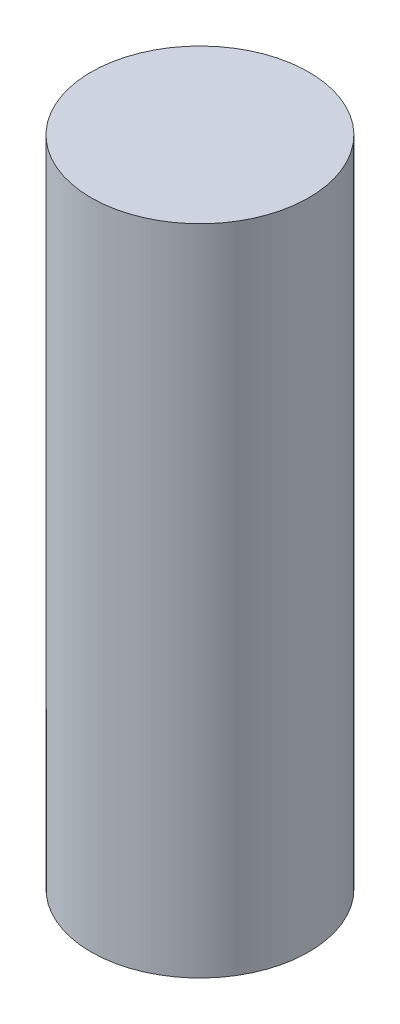
ISO-10303-21;
HEADER;
FILE_DESCRIPTION(('STEP AP214'),'2;1');
FILE_NAME('part.step','',(''),(''),'','','');
FILE_SCHEMA(('AUTOMOTIVE_DESIGN { 1 0 10303 214 1 1 1 1 }'));
ENDSEC;
DATA;
#1=APPLICATION_CONTEXT('core data for automotive mechanical design processes');
#2=APPLICATION_PROTOCOL_DEFINITION('international standard','automotive_design',2000,#1);
#3=PRODUCT_CONTEXT('',#1,'mechanical');
#4=PRODUCT('Part','Part','',(#3));
#5=PRODUCT_RELATED_PRODUCT_CATEGORY('part','',(#4));
#6=PRODUCT_DEFINITION_FORMATION('','',#4);
#7=PRODUCT_DEFINITION_CONTEXT('part definition',#1,'design');
#8=PRODUCT_DEFINITION('design','',#6,#7);
#9=PRODUCT_DEFINITION_SHAPE('','',#8);
#10=(LENGTH_UNIT() NAMED_UNIT(*) SI_UNIT(.MILLI.,.METRE.));
#11=(NAMED_UNIT(*) PLANE_ANGLE_UNIT() SI_UNIT($,.RADIAN.));
#12=(NAMED_UNIT(*) SI_UNIT($,.STERADIAN.) SOLID_ANGLE_UNIT());
#13=UNCERTAINTY_MEASURE_WITH_UNIT(LENGTH_MEASURE(1.E-05),#10,'distance_accuracy_value','');
#14=(GEOMETRIC_REPRESENTATION_CONTEXT(3) GLOBAL_UNCERTAINTY_ASSIGNED_CONTEXT((#13)) GLOBAL_UNIT_ASSIGNED_CONTEXT((#10,
#11,#12)) REPRESENTATION_CONTEXT('',''));
#15=CARTESIAN_POINT('',(0.,0.,0.));
#16=DIRECTION('',(0.,0.,1.));
#17=DIRECTION('',(1.,0.,0.));
#18=AXIS2_PLACEMENT_3D('',#15,#16,#17);
#19=CARTESIAN_POINT('',(0.,25.4,0.));
#20=DIRECTION('',(0.,-1.,0.));
#21=DIRECTION('',(0.,0.,-1.));
#22=AXIS2_PLACEMENT_3D('',#19,#20,#21);
#23=CYLINDRICAL_SURFACE('',#22,6.35);
#24=CARTESIAN_POINT('',(0.,25.4,0.));
#25=DIRECTION('',(0.,1.,0.));
#26=DIRECTION('',(0.,0.,1.));
#27=AXIS2_PLACEMENT_3D('',#24,#25,#26);
#28=CIRCLE('',#27,6.35);
#29=CARTESIAN_POINT('',(0.,25.4,6.35));
#30=VERTEX_POINT('',#29);
#31=EDGE_CURVE('E44',#30,#30,#28,.T.);
#32=ORIENTED_EDGE('',*,*,#31,.F.);
#33=EDGE_LOOP('',(#32));
#34=FACE_BOUND('',#33,.T.);
#35=CARTESIAN_POINT('',(0.,-12.7,0.));
#36=DIRECTION('',(0.,1.,0.));
#37=DIRECTION('',(0.,0.,1.));
#38=AXIS2_PLACEMENT_3D('',#35,#36,#37);
#39=CIRCLE('',#38,6.35);
#40=CARTESIAN_POINT('',(0.,-12.7,6.35));
#41=VERTEX_POINT('',#40);
#42=EDGE_CURVE('E49',#41,#41,#39,.T.);
#43=ORIENTED_EDGE('',*,*,#42,.T.);
#44=EDGE_LOOP('',(#43));
#45=FACE_BOUND('',#44,.T.);
#46=ADVANCED_FACE('F37',(#34,#45),#23,.T.);
#47=CARTESIAN_POINT('',(0.,25.4,0.));
#48=DIRECTION('',(0.,1.,0.));
#49=DIRECTION('',(0.,0.,1.));
#50=AXIS2_PLACEMENT_3D('',#47,#48,#49);
#51=PLANE('',#50);
#52=ORIENTED_EDGE('',*,*,#31,.T.);
#53=EDGE_LOOP('',(#52));
#54=FACE_BOUND('',#53,.T.);
#55=ADVANCED_FACE('F73',(#54),#51,.T.);
#56=CARTESIAN_POINT('',(0.,-12.7,0.));
#57=DIRECTION('',(0.,1.,0.));
#58=DIRECTION('',(0.,0.,1.));
#59=AXIS2_PLACEMENT_3D('',#56,#57,#58);
#60=PLANE('',#59);
#61=CARTESIAN_POINT('',(0.,-12.7,0.));
#62=DIRECTION('',(0.,1.,0.));
#63=DIRECTION('',(0.,0.,1.));
#64=AXIS2_PLACEMENT_3D('',#61,#62,#63);
#65=CIRCLE('',#64,4.7625);
#66=CARTESIAN_POINT('',(0.,-12.7,4.7625));
#67=VERTEX_POINT('',#66);
#68=EDGE_CURVE('E54',#67,#67,#65,.T.);
#69=ORIENTED_EDGE('',*,*,#68,.T.);
#70=EDGE_LOOP('',(#69));
#71=FACE_BOUND('',#70,.T.);
#72=ORIENTED_EDGE('',*,*,#42,.F.);
#73=EDGE_LOOP('',(#72));
#74=FACE_BOUND('',#73,.T.);
#75=ADVANCED_FACE('F61',(#71,#74),#60,.F.);
#76=CARTESIAN_POINT('',(0.,-12.7,0.));
#77=DIRECTION('',(0.,1.,0.));
#78=DIRECTION('',(0.,0.,1.));
#79=AXIS2_PLACEMENT_3D('',#76,#77,#78);
#80=CYLINDRICAL_SURFACE('',#79,4.7625);
#81=ORIENTED_EDGE('',*,*,#68,.F.);
#82=EDGE_LOOP('',(#81));
#83=FACE_BOUND('',#82,.T.);
#84=CARTESIAN_POINT('',(0.,0.,0.));
#85=DIRECTION('',(0.,1.,0.));
#86=DIRECTION('',(0.,0.,1.));
#87=AXIS2_PLACEMENT_3D('',#84,#85,#86);
#88=CIRCLE('',#87,4.7625);
#89=CARTESIAN_POINT('',(0.,0.,4.7625));
#90=VERTEX_POINT('',#89);
#91=EDGE_CURVE('E10',#90,#90,#88,.T.);
#92=ORIENTED_EDGE('',*,*,#91,.T.);
#93=EDGE_LOOP('',(#92));
#94=FACE_BOUND('',#93,.T.);
#95=ADVANCED_FACE('F64',(#83,#94),#80,.F.);
#96=CARTESIAN_POINT('',(0.,0.,0.));
#97=DIRECTION('',(0.,1.,0.));
#98=DIRECTION('',(0.,0.,1.));
#99=AXIS2_PLACEMENT_3D('',#96,#97,#98);
#100=PLANE('',#99);
#101=ORIENTED_EDGE('',*,*,#91,.F.);
#102=EDGE_LOOP('',(#101));
#103=FACE_BOUND('',#102,.T.);
#104=ADVANCED_FACE('F66',(#103),#100,.F.);
#105=CLOSED_SHELL('',(#46,#55,#75,#95,#104));
#106=MANIFOLD_SOLID_BREP('B2',#105);
#107=ADVANCED_BREP_SHAPE_REPRESENTATION('',(#18,#106),#14);
#108=SHAPE_DEFINITION_REPRESENTATION(#9,#107);
ENDSEC;
END-ISO-10303-21;
